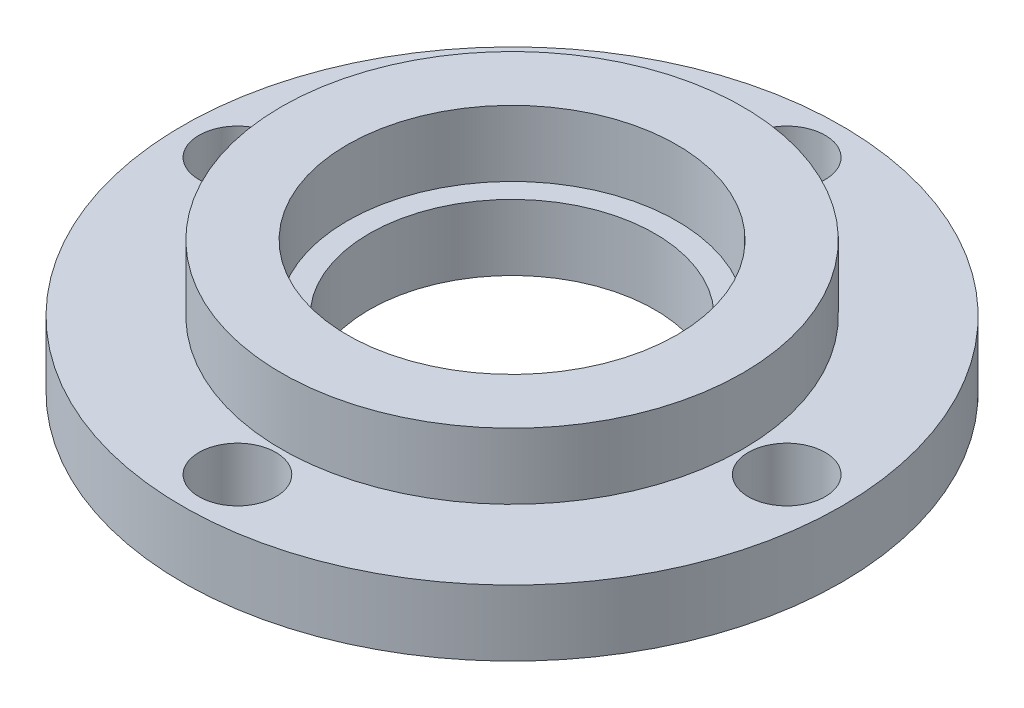
ISO-10303-21;
HEADER;
FILE_DESCRIPTION(('STEP AP214'),'2;1');
FILE_NAME('part.step','',(''),(''),'','','');
FILE_SCHEMA(('AUTOMOTIVE_DESIGN { 1 0 10303 214 1 1 1 1 }'));
ENDSEC;
DATA;
#1=APPLICATION_CONTEXT('core data for automotive mechanical design processes');
#2=APPLICATION_PROTOCOL_DEFINITION('international standard','automotive_design',2000,#1);
#3=PRODUCT_CONTEXT('',#1,'mechanical');
#4=PRODUCT('Part','Part','',(#3));
#5=PRODUCT_RELATED_PRODUCT_CATEGORY('part','',(#4));
#6=PRODUCT_DEFINITION_FORMATION('','',#4);
#7=PRODUCT_DEFINITION_CONTEXT('part definition',#1,'design');
#8=PRODUCT_DEFINITION('design','',#6,#7);
#9=PRODUCT_DEFINITION_SHAPE('','',#8);
#10=(LENGTH_UNIT() NAMED_UNIT(*) SI_UNIT(.MILLI.,.METRE.));
#11=(NAMED_UNIT(*) PLANE_ANGLE_UNIT() SI_UNIT($,.RADIAN.));
#12=(NAMED_UNIT(*) SI_UNIT($,.STERADIAN.) SOLID_ANGLE_UNIT());
#13=UNCERTAINTY_MEASURE_WITH_UNIT(LENGTH_MEASURE(1.E-05),#10,'distance_accuracy_value','');
#14=(GEOMETRIC_REPRESENTATION_CONTEXT(3) GLOBAL_UNCERTAINTY_ASSIGNED_CONTEXT((#13)) GLOBAL_UNIT_ASSIGNED_CONTEXT((#10,
#11,#12)) REPRESENTATION_CONTEXT('',''));
#15=CARTESIAN_POINT('',(0.,0.,0.));
#16=DIRECTION('',(0.,0.,1.));
#17=DIRECTION('',(1.,0.,0.));
#18=AXIS2_PLACEMENT_3D('',#15,#16,#17);
#19=CARTESIAN_POINT('',(-15.,0.,0.));
#20=DIRECTION('',(0.,1.,0.));
#21=DIRECTION('',(-1.,0.,0.));
#22=AXIS2_PLACEMENT_3D('',#19,#20,#21);
#23=PLANE('',#22);
#24=CARTESIAN_POINT('',(0.,0.,-12.5));
#25=DIRECTION('',(0.,1.,0.));
#26=DIRECTION('',(-1.,0.,0.));
#27=AXIS2_PLACEMENT_3D('',#24,#25,#26);
#28=CIRCLE('',#27,1.75);
#29=CARTESIAN_POINT('',(-1.75,0.,-12.5));
#30=VERTEX_POINT('',#29);
#31=EDGE_CURVE('E59',#30,#30,#28,.T.);
#32=ORIENTED_EDGE('',*,*,#31,.T.);
#33=EDGE_LOOP('',(#32));
#34=FACE_BOUND('',#33,.T.);
#35=CARTESIAN_POINT('',(12.5,0.,0.));
#36=DIRECTION('',(0.,1.,0.));
#37=DIRECTION('',(-1.,0.,0.));
#38=AXIS2_PLACEMENT_3D('',#35,#36,#37);
#39=CIRCLE('',#38,1.75);
#40=CARTESIAN_POINT('',(10.75,0.,0.));
#41=VERTEX_POINT('',#40);
#42=EDGE_CURVE('E144',#41,#41,#39,.T.);
#43=ORIENTED_EDGE('',*,*,#42,.T.);
#44=EDGE_LOOP('',(#43));
#45=FACE_BOUND('',#44,.T.);
#46=CARTESIAN_POINT('',(0.,0.,12.5));
#47=DIRECTION('',(0.,1.,0.));
#48=DIRECTION('',(-1.,0.,0.));
#49=AXIS2_PLACEMENT_3D('',#46,#47,#48);
#50=CIRCLE('',#49,1.75);
#51=CARTESIAN_POINT('',(-1.75000000000009,0.,12.5));
#52=VERTEX_POINT('',#51);
#53=EDGE_CURVE('E147',#52,#52,#50,.T.);
#54=ORIENTED_EDGE('',*,*,#53,.T.);
#55=EDGE_LOOP('',(#54));
#56=FACE_BOUND('',#55,.T.);
#57=CARTESIAN_POINT('',(-12.5,0.,-1.30930550206617E-13));
#58=DIRECTION('',(0.,1.,0.));
#59=DIRECTION('',(-1.,0.,0.));
#60=AXIS2_PLACEMENT_3D('',#57,#58,#59);
#61=CIRCLE('',#60,1.75);
#62=CARTESIAN_POINT('',(-14.25,0.,-1.30930550206617E-13));
#63=VERTEX_POINT('',#62);
#64=EDGE_CURVE('E78',#63,#63,#61,.T.);
#65=ORIENTED_EDGE('',*,*,#64,.T.);
#66=EDGE_LOOP('',(#65));
#67=FACE_BOUND('',#66,.T.);
#68=CARTESIAN_POINT('',(0.,0.,0.));
#69=DIRECTION('',(0.,-1.,0.));
#70=DIRECTION('',(1.,0.,0.));
#71=AXIS2_PLACEMENT_3D('',#68,#69,#70);
#72=CIRCLE('',#71,6.49999999999999);
#73=CARTESIAN_POINT('',(6.49999999999999,0.,0.));
#74=VERTEX_POINT('',#73);
#75=EDGE_CURVE('E10',#74,#74,#72,.T.);
#76=ORIENTED_EDGE('',*,*,#75,.F.);
#77=EDGE_LOOP('',(#76));
#78=FACE_BOUND('',#77,.T.);
#79=CARTESIAN_POINT('',(0.,0.,0.));
#80=DIRECTION('',(0.,-1.,0.));
#81=DIRECTION('',(1.,0.,0.));
#82=AXIS2_PLACEMENT_3D('',#79,#80,#81);
#83=CIRCLE('',#82,15.);
#84=CARTESIAN_POINT('',(15.,1.06964886214544E-13,0.));
#85=VERTEX_POINT('',#84);
#86=EDGE_CURVE('E66',#85,#85,#83,.T.);
#87=ORIENTED_EDGE('',*,*,#86,.T.);
#88=EDGE_LOOP('',(#87));
#89=FACE_BOUND('',#88,.T.);
#90=ADVANCED_FACE('F39',(#34,#45,#56,#67,#78,#89),#23,.F.);
#91=CARTESIAN_POINT('',(1.58793388701212E-12,-462.920880533138,0.));
#92=DIRECTION('',(0.,-1.,0.));
#93=DIRECTION('',(1.,0.,0.));
#94=AXIS2_PLACEMENT_3D('',#91,#92,#93);
#95=CYLINDRICAL_SURFACE('',#94,6.49999999999998);
#96=CARTESIAN_POINT('',(0.,3.,0.));
#97=DIRECTION('',(0.,-1.,0.));
#98=DIRECTION('',(1.,0.,0.));
#99=AXIS2_PLACEMENT_3D('',#96,#97,#98);
#100=CIRCLE('',#99,6.49999999999998);
#101=CARTESIAN_POINT('',(6.49999999999997,3.00000000000002,0.));
#102=VERTEX_POINT('',#101);
#103=EDGE_CURVE('E46',#102,#102,#100,.T.);
#104=ORIENTED_EDGE('',*,*,#103,.F.);
#105=EDGE_LOOP('',(#104));
#106=FACE_BOUND('',#105,.T.);
#107=ORIENTED_EDGE('',*,*,#75,.T.);
#108=EDGE_LOOP('',(#107));
#109=FACE_BOUND('',#108,.T.);
#110=ADVANCED_FACE('F96',(#106,#109),#95,.F.);
#111=CARTESIAN_POINT('',(-6.49999999999999,3.,0.));
#112=DIRECTION('',(0.,-1.,0.));
#113=DIRECTION('',(1.,0.,0.));
#114=AXIS2_PLACEMENT_3D('',#111,#112,#113);
#115=PLANE('',#114);
#116=CARTESIAN_POINT('',(0.,3.,0.));
#117=DIRECTION('',(0.,-1.,0.));
#118=DIRECTION('',(1.,0.,0.));
#119=AXIS2_PLACEMENT_3D('',#116,#117,#118);
#120=CIRCLE('',#119,7.49999999999999);
#121=CARTESIAN_POINT('',(7.49999999999998,3.00000000000003,0.));
#122=VERTEX_POINT('',#121);
#123=EDGE_CURVE('E51',#122,#122,#120,.T.);
#124=ORIENTED_EDGE('',*,*,#123,.F.);
#125=EDGE_LOOP('',(#124));
#126=FACE_BOUND('',#125,.T.);
#127=ORIENTED_EDGE('',*,*,#103,.T.);
#128=EDGE_LOOP('',(#127));
#129=FACE_BOUND('',#128,.T.);
#130=ADVANCED_FACE('F93',(#126,#129),#115,.F.);
#131=CARTESIAN_POINT('',(1.58793388701212E-12,-462.920880533138,0.));
#132=DIRECTION('',(0.,-1.,0.));
#133=DIRECTION('',(1.,0.,0.));
#134=AXIS2_PLACEMENT_3D('',#131,#132,#133);
#135=CYLINDRICAL_SURFACE('',#134,7.49999999999998);
#136=CARTESIAN_POINT('',(0.,6.00000000000001,0.));
#137=DIRECTION('',(0.,-1.,0.));
#138=DIRECTION('',(1.,0.,0.));
#139=AXIS2_PLACEMENT_3D('',#136,#137,#138);
#140=CIRCLE('',#139,7.49999999999998);
#141=CARTESIAN_POINT('',(7.49999999999996,6.00000000000003,0.));
#142=VERTEX_POINT('',#141);
#143=EDGE_CURVE('E86',#142,#142,#140,.T.);
#144=ORIENTED_EDGE('',*,*,#143,.F.);
#145=EDGE_LOOP('',(#144));
#146=FACE_BOUND('',#145,.T.);
#147=ORIENTED_EDGE('',*,*,#123,.T.);
#148=EDGE_LOOP('',(#147));
#149=FACE_BOUND('',#148,.T.);
#150=ADVANCED_FACE('F91',(#146,#149),#135,.F.);
#151=CARTESIAN_POINT('',(-10.5,5.99999999999999,0.));
#152=DIRECTION('',(0.,-1.,0.));
#153=DIRECTION('',(1.,0.,0.));
#154=AXIS2_PLACEMENT_3D('',#151,#152,#153);
#155=PLANE('',#154);
#156=CARTESIAN_POINT('',(0.,6.00000000000006,0.));
#157=DIRECTION('',(0.,-1.,0.));
#158=DIRECTION('',(1.,0.,0.));
#159=AXIS2_PLACEMENT_3D('',#156,#157,#158);
#160=CIRCLE('',#159,10.5);
#161=CARTESIAN_POINT('',(10.5,6.0000000000001,0.));
#162=VERTEX_POINT('',#161);
#163=EDGE_CURVE('E83',#162,#162,#160,.T.);
#164=ORIENTED_EDGE('',*,*,#163,.F.);
#165=EDGE_LOOP('',(#164));
#166=FACE_BOUND('',#165,.T.);
#167=ORIENTED_EDGE('',*,*,#143,.T.);
#168=EDGE_LOOP('',(#167));
#169=FACE_BOUND('',#168,.T.);
#170=ADVANCED_FACE('F108',(#166,#169),#155,.F.);
#171=CARTESIAN_POINT('',(1.58793388701212E-12,-462.920880533138,0.));
#172=DIRECTION('',(0.,-1.,0.));
#173=DIRECTION('',(1.,0.,0.));
#174=AXIS2_PLACEMENT_3D('',#171,#172,#173);
#175=CYLINDRICAL_SURFACE('',#174,10.5);
#176=CARTESIAN_POINT('',(0.,3.00000000000006,0.));
#177=DIRECTION('',(0.,-1.,0.));
#178=DIRECTION('',(1.,0.,0.));
#179=AXIS2_PLACEMENT_3D('',#176,#177,#178);
#180=CIRCLE('',#179,10.5);
#181=CARTESIAN_POINT('',(10.5,3.00000000000009,0.));
#182=VERTEX_POINT('',#181);
#183=EDGE_CURVE('E75',#182,#182,#180,.T.);
#184=ORIENTED_EDGE('',*,*,#183,.F.);
#185=EDGE_LOOP('',(#184));
#186=FACE_BOUND('',#185,.T.);
#187=ORIENTED_EDGE('',*,*,#163,.T.);
#188=EDGE_LOOP('',(#187));
#189=FACE_BOUND('',#188,.T.);
#190=ADVANCED_FACE('F112',(#186,#189),#175,.T.);
#191=CARTESIAN_POINT('',(-15.,2.99999999999999,0.));
#192=DIRECTION('',(0.,-1.,0.));
#193=DIRECTION('',(1.,0.,0.));
#194=AXIS2_PLACEMENT_3D('',#191,#192,#193);
#195=PLANE('',#194);
#196=CARTESIAN_POINT('',(0.,3.00000000000004,-12.5));
#197=DIRECTION('',(0.,-1.,0.));
#198=DIRECTION('',(1.,0.,0.));
#199=AXIS2_PLACEMENT_3D('',#196,#197,#198);
#200=CIRCLE('',#199,1.75);
#201=CARTESIAN_POINT('',(-1.75000000000001,3.00000000000004,-12.5));
#202=VERTEX_POINT('',#201);
#203=EDGE_CURVE('E42',#202,#202,#200,.T.);
#204=ORIENTED_EDGE('',*,*,#203,.T.);
#205=EDGE_LOOP('',(#204));
#206=FACE_BOUND('',#205,.T.);
#207=CARTESIAN_POINT('',(12.5,3.00000000000009,0.));
#208=DIRECTION('',(0.,-1.,0.));
#209=DIRECTION('',(1.,0.,0.));
#210=AXIS2_PLACEMENT_3D('',#207,#208,#209);
#211=CIRCLE('',#210,1.75);
#212=CARTESIAN_POINT('',(10.75,3.00000000000008,0.));
#213=VERTEX_POINT('',#212);
#214=EDGE_CURVE('E61',#213,#213,#211,.T.);
#215=ORIENTED_EDGE('',*,*,#214,.T.);
#216=EDGE_LOOP('',(#215));
#217=FACE_BOUND('',#216,.T.);
#218=CARTESIAN_POINT('',(0.,3.00000000000004,12.5));
#219=DIRECTION('',(0.,-1.,0.));
#220=DIRECTION('',(1.,0.,0.));
#221=AXIS2_PLACEMENT_3D('',#218,#219,#220);
#222=CIRCLE('',#221,1.75);
#223=CARTESIAN_POINT('',(-1.7500000000001,3.00000000000004,12.5));
#224=VERTEX_POINT('',#223);
#225=EDGE_CURVE('E58',#224,#224,#222,.T.);
#226=ORIENTED_EDGE('',*,*,#225,.T.);
#227=EDGE_LOOP('',(#226));
#228=FACE_BOUND('',#227,.T.);
#229=CARTESIAN_POINT('',(-12.5,3.,-1.30930550206617E-13));
#230=DIRECTION('',(0.,-1.,0.));
#231=DIRECTION('',(1.,0.,0.));
#232=AXIS2_PLACEMENT_3D('',#229,#230,#231);
#233=CIRCLE('',#232,1.75);
#234=CARTESIAN_POINT('',(-14.25,2.99999999999999,-1.30930550206617E-13));
#235=VERTEX_POINT('',#234);
#236=EDGE_CURVE('E55',#235,#235,#233,.T.);
#237=ORIENTED_EDGE('',*,*,#236,.T.);
#238=EDGE_LOOP('',(#237));
#239=FACE_BOUND('',#238,.T.);
#240=CARTESIAN_POINT('',(0.,3.00000000000006,0.));
#241=DIRECTION('',(0.,-1.,0.));
#242=DIRECTION('',(1.,0.,0.));
#243=AXIS2_PLACEMENT_3D('',#240,#241,#242);
#244=CIRCLE('',#243,15.);
#245=CARTESIAN_POINT('',(15.,3.00000000000011,0.));
#246=VERTEX_POINT('',#245);
#247=EDGE_CURVE('E70',#246,#246,#244,.T.);
#248=ORIENTED_EDGE('',*,*,#247,.F.);
#249=EDGE_LOOP('',(#248));
#250=FACE_BOUND('',#249,.T.);
#251=ORIENTED_EDGE('',*,*,#183,.T.);
#252=EDGE_LOOP('',(#251));
#253=FACE_BOUND('',#252,.T.);
#254=ADVANCED_FACE('F116',(#206,#217,#228,#239,#250,#253),#195,.F.);
#255=CARTESIAN_POINT('',(1.58793388701212E-12,-462.920880533138,0.));
#256=DIRECTION('',(0.,-1.,0.));
#257=DIRECTION('',(1.,0.,0.));
#258=AXIS2_PLACEMENT_3D('',#255,#256,#257);
#259=CYLINDRICAL_SURFACE('',#258,15.);
#260=ORIENTED_EDGE('',*,*,#86,.F.);
#261=EDGE_LOOP('',(#260));
#262=FACE_BOUND('',#261,.T.);
#263=ORIENTED_EDGE('',*,*,#247,.T.);
#264=EDGE_LOOP('',(#263));
#265=FACE_BOUND('',#264,.T.);
#266=ADVANCED_FACE('F120',(#262,#265),#259,.T.);
#267=CARTESIAN_POINT('',(-12.5,0.,-1.30930550206617E-13));
#268=DIRECTION('',(0.,1.,0.));
#269=DIRECTION('',(-1.,0.,0.));
#270=AXIS2_PLACEMENT_3D('',#267,#268,#269);
#271=CYLINDRICAL_SURFACE('',#270,1.75);
#272=CARTESIAN_POINT('',(-14.25,0.,-1.30930550206617E-13));
#273=CARTESIAN_POINT('',(-14.25,0.0312499999999227,-1.30930550206617E-13));
#274=CARTESIAN_POINT('',(-14.25,0.0624999999999235,-1.30930550206617E-13));
#275=CARTESIAN_POINT('',(-14.25,0.124999999999925,-1.30930550206617E-13));
#276=CARTESIAN_POINT('',(-14.25,0.156249999999926,-1.30930550206617E-13));
#277=CARTESIAN_POINT('',(-14.25,0.218749999999927,-1.30930550206617E-13));
#278=CARTESIAN_POINT('',(-14.25,0.249999999999928,-1.30930550206617E-13));
#279=CARTESIAN_POINT('',(-14.25,0.31249999999993,-1.30930550206617E-13));
#280=CARTESIAN_POINT('',(-14.25,0.34374999999993,-1.30930550206617E-13));
#281=CARTESIAN_POINT('',(-14.25,0.406249999999932,-1.30930550206617E-13));
#282=CARTESIAN_POINT('',(-14.25,0.437499999999933,-1.30930550206617E-13));
#283=CARTESIAN_POINT('',(-14.25,0.499999999999934,-1.30930550206617E-13));
#284=CARTESIAN_POINT('',(-14.25,0.531249999999935,-1.30930550206617E-13));
#285=CARTESIAN_POINT('',(-14.25,0.593749999999936,-1.30930550206617E-13));
#286=CARTESIAN_POINT('',(-14.25,0.624999999999937,-1.30930550206617E-13));
#287=CARTESIAN_POINT('',(-14.25,0.687499999999939,-1.30930550206617E-13));
#288=CARTESIAN_POINT('',(-14.25,0.718749999999939,-1.30930550206617E-13));
#289=CARTESIAN_POINT('',(-14.25,0.781249999999941,-1.30930550206617E-13));
#290=CARTESIAN_POINT('',(-14.25,0.812499999999942,-1.30930550206617E-13));
#291=CARTESIAN_POINT('',(-14.25,0.874999999999943,-1.30930550206617E-13));
#292=CARTESIAN_POINT('',(-14.25,0.906249999999944,-1.30930550206617E-13));
#293=CARTESIAN_POINT('',(-14.25,0.968749999999945,-1.30930550206617E-13));
#294=CARTESIAN_POINT('',(-14.25,0.999999999999946,-1.30930550206617E-13));
#295=CARTESIAN_POINT('',(-14.25,1.06249999999995,-1.30930550206617E-13));
#296=CARTESIAN_POINT('',(-14.25,1.09374999999995,-1.30930550206617E-13));
#297=CARTESIAN_POINT('',(-14.25,1.15624999999995,-1.30930550206617E-13));
#298=CARTESIAN_POINT('',(-14.25,1.18749999999995,-1.30930550206617E-13));
#299=CARTESIAN_POINT('',(-14.25,1.24999999999995,-1.30930550206617E-13));
#300=CARTESIAN_POINT('',(-14.25,1.28124999999995,-1.30930550206617E-13));
#301=CARTESIAN_POINT('',(-14.25,1.34374999999995,-1.30930550206617E-13));
#302=CARTESIAN_POINT('',(-14.25,1.37499999999996,-1.30930550206617E-13));
#303=CARTESIAN_POINT('',(-14.25,1.43749999999996,-1.30930550206617E-13));
#304=CARTESIAN_POINT('',(-14.25,1.46874999999996,-1.30930550206617E-13));
#305=CARTESIAN_POINT('',(-14.25,1.53124999999996,-1.30930550206617E-13));
#306=CARTESIAN_POINT('',(-14.25,1.56249999999996,-1.30930550206617E-13));
#307=CARTESIAN_POINT('',(-14.25,1.62499999999996,-1.30930550206617E-13));
#308=CARTESIAN_POINT('',(-14.25,1.65624999999996,-1.30930550206617E-13));
#309=CARTESIAN_POINT('',(-14.25,1.71874999999996,-1.30930550206617E-13));
#310=CARTESIAN_POINT('',(-14.25,1.74999999999996,-1.30930550206617E-13));
#311=CARTESIAN_POINT('',(-14.25,1.81249999999997,-1.30930550206617E-13));
#312=CARTESIAN_POINT('',(-14.25,1.84374999999997,-1.30930550206617E-13));
#313=CARTESIAN_POINT('',(-14.25,1.90624999999997,-1.30930550206617E-13));
#314=CARTESIAN_POINT('',(-14.25,1.93749999999997,-1.30930550206617E-13));
#315=CARTESIAN_POINT('',(-14.25,1.99999999999997,-1.30930550206617E-13));
#316=CARTESIAN_POINT('',(-14.25,2.03124999999997,-1.30930550206617E-13));
#317=CARTESIAN_POINT('',(-14.25,2.09374999999997,-1.30930550206617E-13));
#318=CARTESIAN_POINT('',(-14.25,2.12499999999997,-1.30930550206617E-13));
#319=CARTESIAN_POINT('',(-14.25,2.18749999999997,-1.30930550206617E-13));
#320=CARTESIAN_POINT('',(-14.25,2.21874999999998,-1.30930550206617E-13));
#321=CARTESIAN_POINT('',(-14.25,2.28124999999998,-1.30930550206617E-13));
#322=CARTESIAN_POINT('',(-14.25,2.31249999999998,-1.30930550206617E-13));
#323=CARTESIAN_POINT('',(-14.25,2.37499999999998,-1.30930550206617E-13));
#324=CARTESIAN_POINT('',(-14.25,2.40624999999998,-1.30930550206617E-13));
#325=CARTESIAN_POINT('',(-14.25,2.46874999999998,-1.30930550206617E-13));
#326=CARTESIAN_POINT('',(-14.25,2.49999999999998,-1.30930550206617E-13));
#327=CARTESIAN_POINT('',(-14.25,2.56249999999998,-1.30930550206617E-13));
#328=CARTESIAN_POINT('',(-14.25,2.59374999999998,-1.30930550206617E-13));
#329=CARTESIAN_POINT('',(-14.25,2.65624999999999,-1.30930550206617E-13));
#330=CARTESIAN_POINT('',(-14.25,2.68749999999999,-1.30930550206617E-13));
#331=CARTESIAN_POINT('',(-14.25,2.74999999999999,-1.30930550206617E-13));
#332=CARTESIAN_POINT('',(-14.25,2.78124999999999,-1.30930550206617E-13));
#333=CARTESIAN_POINT('',(-14.25,2.84374999999999,-1.30930550206617E-13));
#334=CARTESIAN_POINT('',(-14.25,2.87499999999999,-1.30930550206617E-13));
#335=CARTESIAN_POINT('',(-14.25,2.93749999999999,-1.30930550206617E-13));
#336=CARTESIAN_POINT('',(-14.25,2.96874999999999,-1.30930550206617E-13));
#337=CARTESIAN_POINT('',(-14.25,2.99999999999999,-1.30930550206617E-13));
#338=B_SPLINE_CURVE_WITH_KNOTS('',3,(#272,#273,#274,#275,#276,#277,#278,#279,#280,#281,#282,
#283,#284,#285,#286,#287,#288,#289,#290,#291,#292,#293,#294,#295,#296,#297,#298,#299,#300,#301,
#302,#303,#304,#305,#306,#307,#308,#309,#310,#311,#312,#313,#314,#315,#316,#317,#318,#319,#320,
#321,#322,#323,#324,#325,#326,#327,#328,#329,#330,#331,#332,#333,#334,#335,#336,#337),
.UNSPECIFIED.,.F.,.F.,(4,2,2,2,2,2,2,2,2,2,2,2,2,2,2,2,2,2,2,2,2,2,2,2,2,2,2,2,2,2,2,2,4),(0.,
0.0937500000000023,0.187500000000005,0.281250000000007,0.375000000000009,0.468750000000011,
0.562500000000014,0.656250000000016,0.750000000000018,0.84375000000002,0.937500000000023,
1.03125000000002,1.12500000000003,1.21875000000003,1.31250000000003,1.40625000000003,
1.50000000000004,1.59375000000004,1.68750000000004,1.78125000000004,1.87500000000005,
1.96875000000005,2.06250000000005,2.15625000000005,2.25000000000005,2.34375000000006,
2.43750000000006,2.53125000000006,2.62500000000006,2.71875000000007,2.81250000000007,
2.90625000000007,3.00000000000007),.UNSPECIFIED.);
#339=EDGE_CURVE('BSEAM123',#63,#235,#338,.T.);
#340=ORIENTED_EDGE('',*,*,#64,.F.);
#341=ORIENTED_EDGE('',*,*,#236,.F.);
#342=ORIENTED_EDGE('',*,*,#339,.T.);
#343=ORIENTED_EDGE('',*,*,#339,.F.);
#344=EDGE_LOOP('',(#340,#342,#341,#343));
#345=FACE_BOUND('',#344,.T.);
#346=ADVANCED_FACE('F123',(#345),#271,.F.);
#347=CARTESIAN_POINT('',(0.,0.,12.5));
#348=DIRECTION('',(0.,1.,0.));
#349=DIRECTION('',(-1.,0.,0.));
#350=AXIS2_PLACEMENT_3D('',#347,#348,#349);
#351=CYLINDRICAL_SURFACE('',#350,1.75);
#352=CARTESIAN_POINT('',(-1.75000000000009,0.,12.5));
#353=CARTESIAN_POINT('',(-1.75000000000009,0.0312499999999657,12.5));
#354=CARTESIAN_POINT('',(-1.75000000000009,0.0624999999999664,12.5));
#355=CARTESIAN_POINT('',(-1.75000000000009,0.124999999999968,12.5));
#356=CARTESIAN_POINT('',(-1.75000000000009,0.156249999999969,12.5));
#357=CARTESIAN_POINT('',(-1.75000000000009,0.21874999999997,12.5));
#358=CARTESIAN_POINT('',(-1.75000000000009,0.249999999999971,12.5));
#359=CARTESIAN_POINT('',(-1.75000000000009,0.312499999999972,12.5));
#360=CARTESIAN_POINT('',(-1.75000000000009,0.343749999999973,12.5));
#361=CARTESIAN_POINT('',(-1.75000000000009,0.406249999999975,12.5));
#362=CARTESIAN_POINT('',(-1.75000000000009,0.437499999999976,12.5));
#363=CARTESIAN_POINT('',(-1.75000000000009,0.499999999999977,12.5));
#364=CARTESIAN_POINT('',(-1.75000000000009,0.531249999999978,12.5));
#365=CARTESIAN_POINT('',(-1.75000000000009,0.593749999999979,12.5));
#366=CARTESIAN_POINT('',(-1.75000000000009,0.62499999999998,12.5));
#367=CARTESIAN_POINT('',(-1.75000000000009,0.687499999999982,12.5));
#368=CARTESIAN_POINT('',(-1.75000000000009,0.718749999999982,12.5));
#369=CARTESIAN_POINT('',(-1.75000000000009,0.781249999999984,12.5));
#370=CARTESIAN_POINT('',(-1.75000000000009,0.812499999999985,12.5));
#371=CARTESIAN_POINT('',(-1.75000000000009,0.874999999999986,12.5));
#372=CARTESIAN_POINT('',(-1.75000000000009,0.906249999999987,12.5));
#373=CARTESIAN_POINT('',(-1.75000000000009,0.968749999999988,12.5));
#374=CARTESIAN_POINT('',(-1.75000000000009,0.999999999999989,12.5));
#375=CARTESIAN_POINT('',(-1.75000000000009,1.06249999999999,12.5));
#376=CARTESIAN_POINT('',(-1.75000000000009,1.09374999999999,12.5));
#377=CARTESIAN_POINT('',(-1.75000000000009,1.15624999999999,12.5));
#378=CARTESIAN_POINT('',(-1.75000000000009,1.18749999999999,12.5));
#379=CARTESIAN_POINT('',(-1.75000000000009,1.25,12.5));
#380=CARTESIAN_POINT('',(-1.75000000000009,1.28125,12.5));
#381=CARTESIAN_POINT('',(-1.75000000000009,1.34375,12.5));
#382=CARTESIAN_POINT('',(-1.75000000000009,1.375,12.5));
#383=CARTESIAN_POINT('',(-1.75000000000009,1.4375,12.5));
#384=CARTESIAN_POINT('',(-1.75000000000009,1.46875,12.5));
#385=CARTESIAN_POINT('',(-1.75000000000009,1.53125,12.5));
#386=CARTESIAN_POINT('',(-1.75000000000009,1.5625,12.5));
#387=CARTESIAN_POINT('',(-1.75000000000009,1.625,12.5));
#388=CARTESIAN_POINT('',(-1.75000000000009,1.65625,12.5));
#389=CARTESIAN_POINT('',(-1.75000000000009,1.71875000000001,12.5));
#390=CARTESIAN_POINT('',(-1.75000000000009,1.75000000000001,12.5));
#391=CARTESIAN_POINT('',(-1.75000000000009,1.81250000000001,12.5));
#392=CARTESIAN_POINT('',(-1.75000000000009,1.84375000000001,12.5));
#393=CARTESIAN_POINT('',(-1.75000000000009,1.90625000000001,12.5));
#394=CARTESIAN_POINT('',(-1.75000000000009,1.93750000000001,12.5));
#395=CARTESIAN_POINT('',(-1.75000000000009,2.00000000000001,12.5));
#396=CARTESIAN_POINT('',(-1.75000000000009,2.03125000000001,12.5));
#397=CARTESIAN_POINT('',(-1.75000000000009,2.09375000000002,12.5));
#398=CARTESIAN_POINT('',(-1.75000000000009,2.12500000000002,12.5));
#399=CARTESIAN_POINT('',(-1.75000000000009,2.18750000000002,12.5));
#400=CARTESIAN_POINT('',(-1.75000000000009,2.21875000000002,12.5));
#401=CARTESIAN_POINT('',(-1.7500000000001,2.28125000000002,12.5));
#402=CARTESIAN_POINT('',(-1.7500000000001,2.31250000000002,12.5));
#403=CARTESIAN_POINT('',(-1.7500000000001,2.37500000000002,12.5));
#404=CARTESIAN_POINT('',(-1.7500000000001,2.40625000000002,12.5));
#405=CARTESIAN_POINT('',(-1.7500000000001,2.46875000000002,12.5));
#406=CARTESIAN_POINT('',(-1.7500000000001,2.50000000000003,12.5));
#407=CARTESIAN_POINT('',(-1.7500000000001,2.56250000000003,12.5));
#408=CARTESIAN_POINT('',(-1.7500000000001,2.59375000000003,12.5));
#409=CARTESIAN_POINT('',(-1.7500000000001,2.65625000000003,12.5));
#410=CARTESIAN_POINT('',(-1.7500000000001,2.68750000000003,12.5));
#411=CARTESIAN_POINT('',(-1.7500000000001,2.75000000000003,12.5));
#412=CARTESIAN_POINT('',(-1.7500000000001,2.78125000000003,12.5));
#413=CARTESIAN_POINT('',(-1.7500000000001,2.84375000000003,12.5));
#414=CARTESIAN_POINT('',(-1.7500000000001,2.87500000000003,12.5));
#415=CARTESIAN_POINT('',(-1.7500000000001,2.93750000000004,12.5));
#416=CARTESIAN_POINT('',(-1.7500000000001,2.96875000000004,12.5));
#417=CARTESIAN_POINT('',(-1.7500000000001,3.00000000000004,12.5));
#418=B_SPLINE_CURVE_WITH_KNOTS('',3,(#352,#353,#354,#355,#356,#357,#358,#359,#360,#361,#362,
#363,#364,#365,#366,#367,#368,#369,#370,#371,#372,#373,#374,#375,#376,#377,#378,#379,#380,#381,
#382,#383,#384,#385,#386,#387,#388,#389,#390,#391,#392,#393,#394,#395,#396,#397,#398,#399,#400,
#401,#402,#403,#404,#405,#406,#407,#408,#409,#410,#411,#412,#413,#414,#415,#416,#417),
.UNSPECIFIED.,.F.,.F.,(4,2,2,2,2,2,2,2,2,2,2,2,2,2,2,2,2,2,2,2,2,2,2,2,2,2,2,2,2,2,2,2,4),(0.,
0.0937500000000023,0.187500000000005,0.281250000000007,0.375000000000009,0.468750000000011,
0.562500000000014,0.656250000000016,0.750000000000018,0.84375000000002,0.937500000000023,
1.03125000000002,1.12500000000003,1.21875000000003,1.31250000000003,1.40625000000003,
1.50000000000004,1.59375000000004,1.68750000000004,1.78125000000004,1.87500000000005,
1.96875000000005,2.06250000000005,2.15625000000005,2.25000000000005,2.34375000000006,
2.43750000000006,2.53125000000006,2.62500000000006,2.71875000000007,2.81250000000007,
2.90625000000007,3.00000000000007),.UNSPECIFIED.);
#419=EDGE_CURVE('BSEAM127',#52,#224,#418,.T.);
#420=ORIENTED_EDGE('',*,*,#53,.F.);
#421=ORIENTED_EDGE('',*,*,#225,.F.);
#422=ORIENTED_EDGE('',*,*,#419,.T.);
#423=ORIENTED_EDGE('',*,*,#419,.F.);
#424=EDGE_LOOP('',(#420,#422,#421,#423));
#425=FACE_BOUND('',#424,.T.);
#426=ADVANCED_FACE('F127',(#425),#351,.F.);
#427=CARTESIAN_POINT('',(12.5,0.,0.));
#428=DIRECTION('',(0.,1.,0.));
#429=DIRECTION('',(-1.,0.,0.));
#430=AXIS2_PLACEMENT_3D('',#427,#428,#429);
#431=CYLINDRICAL_SURFACE('',#430,1.75);
#432=CARTESIAN_POINT('',(10.75,0.,0.));
#433=CARTESIAN_POINT('',(10.75,0.0312500000000086,0.));
#434=CARTESIAN_POINT('',(10.75,0.0625000000000094,0.));
#435=CARTESIAN_POINT('',(10.75,0.125000000000011,0.));
#436=CARTESIAN_POINT('',(10.75,0.156250000000012,0.));
#437=CARTESIAN_POINT('',(10.75,0.218750000000013,0.));
#438=CARTESIAN_POINT('',(10.75,0.250000000000014,0.));
#439=CARTESIAN_POINT('',(10.75,0.312500000000015,0.));
#440=CARTESIAN_POINT('',(10.75,0.343750000000016,0.));
#441=CARTESIAN_POINT('',(10.75,0.406250000000018,0.));
#442=CARTESIAN_POINT('',(10.75,0.437500000000018,0.));
#443=CARTESIAN_POINT('',(10.75,0.50000000000002,0.));
#444=CARTESIAN_POINT('',(10.75,0.531250000000021,0.));
#445=CARTESIAN_POINT('',(10.75,0.593750000000022,0.));
#446=CARTESIAN_POINT('',(10.75,0.625000000000023,0.));
#447=CARTESIAN_POINT('',(10.75,0.687500000000025,0.));
#448=CARTESIAN_POINT('',(10.75,0.718750000000025,0.));
#449=CARTESIAN_POINT('',(10.75,0.781250000000027,0.));
#450=CARTESIAN_POINT('',(10.75,0.812500000000028,0.));
#451=CARTESIAN_POINT('',(10.75,0.875000000000029,0.));
#452=CARTESIAN_POINT('',(10.75,0.90625000000003,0.));
#453=CARTESIAN_POINT('',(10.75,0.968750000000031,0.));
#454=CARTESIAN_POINT('',(10.75,1.00000000000003,0.));
#455=CARTESIAN_POINT('',(10.75,1.06250000000003,0.));
#456=CARTESIAN_POINT('',(10.75,1.09375000000003,0.));
#457=CARTESIAN_POINT('',(10.75,1.15625000000004,0.));
#458=CARTESIAN_POINT('',(10.75,1.18750000000004,0.));
#459=CARTESIAN_POINT('',(10.75,1.25000000000004,0.));
#460=CARTESIAN_POINT('',(10.75,1.28125000000004,0.));
#461=CARTESIAN_POINT('',(10.75,1.34375000000004,0.));
#462=CARTESIAN_POINT('',(10.75,1.37500000000004,0.));
#463=CARTESIAN_POINT('',(10.75,1.43750000000004,0.));
#464=CARTESIAN_POINT('',(10.75,1.46875000000004,0.));
#465=CARTESIAN_POINT('',(10.75,1.53125000000004,0.));
#466=CARTESIAN_POINT('',(10.75,1.56250000000005,0.));
#467=CARTESIAN_POINT('',(10.75,1.62500000000005,0.));
#468=CARTESIAN_POINT('',(10.75,1.65625000000005,0.));
#469=CARTESIAN_POINT('',(10.75,1.71875000000005,0.));
#470=CARTESIAN_POINT('',(10.75,1.75000000000005,0.));
#471=CARTESIAN_POINT('',(10.75,1.81250000000005,0.));
#472=CARTESIAN_POINT('',(10.75,1.84375000000005,0.));
#473=CARTESIAN_POINT('',(10.75,1.90625000000005,0.));
#474=CARTESIAN_POINT('',(10.75,1.93750000000005,0.));
#475=CARTESIAN_POINT('',(10.75,2.00000000000006,0.));
#476=CARTESIAN_POINT('',(10.75,2.03125000000006,0.));
#477=CARTESIAN_POINT('',(10.75,2.09375000000006,0.));
#478=CARTESIAN_POINT('',(10.75,2.12500000000006,0.));
#479=CARTESIAN_POINT('',(10.75,2.18750000000006,0.));
#480=CARTESIAN_POINT('',(10.75,2.21875000000006,0.));
#481=CARTESIAN_POINT('',(10.75,2.28125000000006,0.));
#482=CARTESIAN_POINT('',(10.75,2.31250000000006,0.));
#483=CARTESIAN_POINT('',(10.75,2.37500000000007,0.));
#484=CARTESIAN_POINT('',(10.75,2.40625000000007,0.));
#485=CARTESIAN_POINT('',(10.75,2.46875000000007,0.));
#486=CARTESIAN_POINT('',(10.75,2.50000000000007,0.));
#487=CARTESIAN_POINT('',(10.75,2.56250000000007,0.));
#488=CARTESIAN_POINT('',(10.75,2.59375000000007,0.));
#489=CARTESIAN_POINT('',(10.75,2.65625000000007,0.));
#490=CARTESIAN_POINT('',(10.75,2.68750000000007,0.));
#491=CARTESIAN_POINT('',(10.75,2.75000000000007,0.));
#492=CARTESIAN_POINT('',(10.75,2.78125000000008,0.));
#493=CARTESIAN_POINT('',(10.75,2.84375000000008,0.));
#494=CARTESIAN_POINT('',(10.75,2.87500000000008,0.));
#495=CARTESIAN_POINT('',(10.75,2.93750000000008,0.));
#496=CARTESIAN_POINT('',(10.75,2.96875000000008,0.));
#497=CARTESIAN_POINT('',(10.75,3.00000000000008,0.));
#498=B_SPLINE_CURVE_WITH_KNOTS('',3,(#432,#433,#434,#435,#436,#437,#438,#439,#440,#441,#442,
#443,#444,#445,#446,#447,#448,#449,#450,#451,#452,#453,#454,#455,#456,#457,#458,#459,#460,#461,
#462,#463,#464,#465,#466,#467,#468,#469,#470,#471,#472,#473,#474,#475,#476,#477,#478,#479,#480,
#481,#482,#483,#484,#485,#486,#487,#488,#489,#490,#491,#492,#493,#494,#495,#496,#497),
.UNSPECIFIED.,.F.,.F.,(4,2,2,2,2,2,2,2,2,2,2,2,2,2,2,2,2,2,2,2,2,2,2,2,2,2,2,2,2,2,2,2,4),(0.,
0.0937500000000023,0.187500000000005,0.281250000000007,0.375000000000009,0.468750000000011,
0.562500000000014,0.656250000000016,0.750000000000018,0.84375000000002,0.937500000000023,
1.03125000000002,1.12500000000003,1.21875000000003,1.31250000000003,1.40625000000003,
1.50000000000004,1.59375000000004,1.68750000000004,1.78125000000004,1.87500000000005,
1.96875000000005,2.06250000000005,2.15625000000005,2.25000000000005,2.34375000000006,
2.43750000000006,2.53125000000006,2.62500000000006,2.71875000000007,2.81250000000007,
2.90625000000007,3.00000000000007),.UNSPECIFIED.);
#499=EDGE_CURVE('BSEAM131',#41,#213,#498,.T.);
#500=ORIENTED_EDGE('',*,*,#42,.F.);
#501=ORIENTED_EDGE('',*,*,#214,.F.);
#502=ORIENTED_EDGE('',*,*,#499,.T.);
#503=ORIENTED_EDGE('',*,*,#499,.F.);
#504=EDGE_LOOP('',(#500,#502,#501,#503));
#505=FACE_BOUND('',#504,.T.);
#506=ADVANCED_FACE('F131',(#505),#431,.F.);
#507=CARTESIAN_POINT('',(0.,0.,-12.5));
#508=DIRECTION('',(0.,1.,0.));
#509=DIRECTION('',(-1.,0.,0.));
#510=AXIS2_PLACEMENT_3D('',#507,#508,#509);
#511=CYLINDRICAL_SURFACE('',#510,1.75);
#512=CARTESIAN_POINT('',(-1.75,0.,-12.5));
#513=CARTESIAN_POINT('',(-1.75,0.0312499999999657,-12.5));
#514=CARTESIAN_POINT('',(-1.75,0.0624999999999664,-12.5));
#515=CARTESIAN_POINT('',(-1.75,0.124999999999968,-12.5));
#516=CARTESIAN_POINT('',(-1.75,0.156249999999969,-12.5));
#517=CARTESIAN_POINT('',(-1.75,0.21874999999997,-12.5));
#518=CARTESIAN_POINT('',(-1.75,0.249999999999971,-12.5));
#519=CARTESIAN_POINT('',(-1.75,0.312499999999972,-12.5));
#520=CARTESIAN_POINT('',(-1.75,0.343749999999973,-12.5));
#521=CARTESIAN_POINT('',(-1.75,0.406249999999975,-12.5));
#522=CARTESIAN_POINT('',(-1.75,0.437499999999976,-12.5));
#523=CARTESIAN_POINT('',(-1.75,0.499999999999977,-12.5));
#524=CARTESIAN_POINT('',(-1.75,0.531249999999978,-12.5));
#525=CARTESIAN_POINT('',(-1.75,0.593749999999979,-12.5));
#526=CARTESIAN_POINT('',(-1.75,0.62499999999998,-12.5));
#527=CARTESIAN_POINT('',(-1.75,0.687499999999982,-12.5));
#528=CARTESIAN_POINT('',(-1.75,0.718749999999982,-12.5));
#529=CARTESIAN_POINT('',(-1.75,0.781249999999984,-12.5));
#530=CARTESIAN_POINT('',(-1.75,0.812499999999985,-12.5));
#531=CARTESIAN_POINT('',(-1.75,0.874999999999986,-12.5));
#532=CARTESIAN_POINT('',(-1.75,0.906249999999987,-12.5));
#533=CARTESIAN_POINT('',(-1.75,0.968749999999988,-12.5));
#534=CARTESIAN_POINT('',(-1.75,0.999999999999989,-12.5));
#535=CARTESIAN_POINT('',(-1.75,1.06249999999999,-12.5));
#536=CARTESIAN_POINT('',(-1.75,1.09374999999999,-12.5));
#537=CARTESIAN_POINT('',(-1.75,1.15624999999999,-12.5));
#538=CARTESIAN_POINT('',(-1.75,1.18749999999999,-12.5));
#539=CARTESIAN_POINT('',(-1.75,1.25,-12.5));
#540=CARTESIAN_POINT('',(-1.75,1.28125,-12.5));
#541=CARTESIAN_POINT('',(-1.75,1.34375,-12.5));
#542=CARTESIAN_POINT('',(-1.75,1.375,-12.5));
#543=CARTESIAN_POINT('',(-1.75,1.4375,-12.5));
#544=CARTESIAN_POINT('',(-1.75,1.46875,-12.5));
#545=CARTESIAN_POINT('',(-1.75000000000001,1.53125,-12.5));
#546=CARTESIAN_POINT('',(-1.75000000000001,1.5625,-12.5));
#547=CARTESIAN_POINT('',(-1.75000000000001,1.625,-12.5));
#548=CARTESIAN_POINT('',(-1.75000000000001,1.65625,-12.5));
#549=CARTESIAN_POINT('',(-1.75000000000001,1.71875000000001,-12.5));
#550=CARTESIAN_POINT('',(-1.75000000000001,1.75000000000001,-12.5));
#551=CARTESIAN_POINT('',(-1.75000000000001,1.81250000000001,-12.5));
#552=CARTESIAN_POINT('',(-1.75000000000001,1.84375000000001,-12.5));
#553=CARTESIAN_POINT('',(-1.75000000000001,1.90625000000001,-12.5));
#554=CARTESIAN_POINT('',(-1.75000000000001,1.93750000000001,-12.5));
#555=CARTESIAN_POINT('',(-1.75000000000001,2.00000000000001,-12.5));
#556=CARTESIAN_POINT('',(-1.75000000000001,2.03125000000001,-12.5));
#557=CARTESIAN_POINT('',(-1.75000000000001,2.09375000000002,-12.5));
#558=CARTESIAN_POINT('',(-1.75000000000001,2.12500000000002,-12.5));
#559=CARTESIAN_POINT('',(-1.75000000000001,2.18750000000002,-12.5));
#560=CARTESIAN_POINT('',(-1.75000000000001,2.21875000000002,-12.5));
#561=CARTESIAN_POINT('',(-1.75000000000001,2.28125000000002,-12.5));
#562=CARTESIAN_POINT('',(-1.75000000000001,2.31250000000002,-12.5));
#563=CARTESIAN_POINT('',(-1.75000000000001,2.37500000000002,-12.5));
#564=CARTESIAN_POINT('',(-1.75000000000001,2.40625000000002,-12.5));
#565=CARTESIAN_POINT('',(-1.75000000000001,2.46875000000002,-12.5));
#566=CARTESIAN_POINT('',(-1.75000000000001,2.50000000000003,-12.5));
#567=CARTESIAN_POINT('',(-1.75000000000001,2.56250000000003,-12.5));
#568=CARTESIAN_POINT('',(-1.75000000000001,2.59375000000003,-12.5));
#569=CARTESIAN_POINT('',(-1.75000000000001,2.65625000000003,-12.5));
#570=CARTESIAN_POINT('',(-1.75000000000001,2.68750000000003,-12.5));
#571=CARTESIAN_POINT('',(-1.75000000000001,2.75000000000003,-12.5));
#572=CARTESIAN_POINT('',(-1.75000000000001,2.78125000000003,-12.5));
#573=CARTESIAN_POINT('',(-1.75000000000001,2.84375000000003,-12.5));
#574=CARTESIAN_POINT('',(-1.75000000000001,2.87500000000003,-12.5));
#575=CARTESIAN_POINT('',(-1.75000000000001,2.93750000000004,-12.5));
#576=CARTESIAN_POINT('',(-1.75000000000001,2.96875000000004,-12.5));
#577=CARTESIAN_POINT('',(-1.75000000000001,3.00000000000004,-12.5));
#578=B_SPLINE_CURVE_WITH_KNOTS('',3,(#512,#513,#514,#515,#516,#517,#518,#519,#520,#521,#522,
#523,#524,#525,#526,#527,#528,#529,#530,#531,#532,#533,#534,#535,#536,#537,#538,#539,#540,#541,
#542,#543,#544,#545,#546,#547,#548,#549,#550,#551,#552,#553,#554,#555,#556,#557,#558,#559,#560,
#561,#562,#563,#564,#565,#566,#567,#568,#569,#570,#571,#572,#573,#574,#575,#576,#577),
.UNSPECIFIED.,.F.,.F.,(4,2,2,2,2,2,2,2,2,2,2,2,2,2,2,2,2,2,2,2,2,2,2,2,2,2,2,2,2,2,2,2,4),(0.,
0.0937500000000023,0.187500000000005,0.281250000000007,0.375000000000009,0.468750000000011,
0.562500000000014,0.656250000000016,0.750000000000018,0.84375000000002,0.937500000000023,
1.03125000000002,1.12500000000003,1.21875000000003,1.31250000000003,1.40625000000003,
1.50000000000004,1.59375000000004,1.68750000000004,1.78125000000004,1.87500000000005,
1.96875000000005,2.06250000000005,2.15625000000005,2.25000000000005,2.34375000000006,
2.43750000000006,2.53125000000006,2.62500000000006,2.71875000000007,2.81250000000007,
2.90625000000007,3.00000000000007),.UNSPECIFIED.);
#579=EDGE_CURVE('BSEAM135',#30,#202,#578,.T.);
#580=ORIENTED_EDGE('',*,*,#31,.F.);
#581=ORIENTED_EDGE('',*,*,#203,.F.);
#582=ORIENTED_EDGE('',*,*,#579,.T.);
#583=ORIENTED_EDGE('',*,*,#579,.F.);
#584=EDGE_LOOP('',(#580,#582,#581,#583));
#585=FACE_BOUND('',#584,.T.);
#586=ADVANCED_FACE('F135',(#585),#511,.F.);
#587=CLOSED_SHELL('',(#90,#110,#130,#150,#170,#190,#254,#266,#346,#426,#506,#586));
#588=MANIFOLD_SOLID_BREP('B2',#587);
#589=ADVANCED_BREP_SHAPE_REPRESENTATION('',(#18,#588),#14);
#590=SHAPE_DEFINITION_REPRESENTATION(#9,#589);
ENDSEC;
END-ISO-10303-21;
